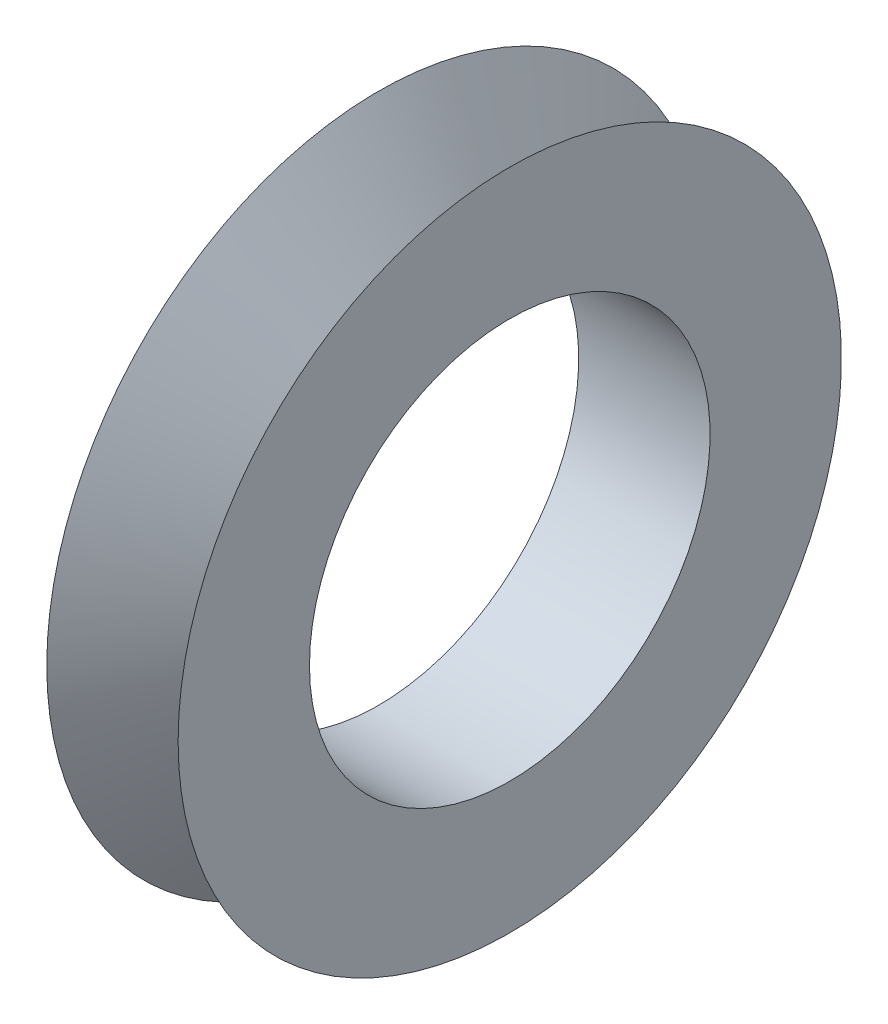
ISO-10303-21;
HEADER;
FILE_DESCRIPTION(('STEP AP214'),'2;1');
FILE_NAME('part.step','',(''),(''),'','','');
FILE_SCHEMA(('AUTOMOTIVE_DESIGN { 1 0 10303 214 1 1 1 1 }'));
ENDSEC;
DATA;
#1=APPLICATION_CONTEXT('core data for automotive mechanical design processes');
#2=APPLICATION_PROTOCOL_DEFINITION('international standard','automotive_design',2000,#1);
#3=PRODUCT_CONTEXT('',#1,'mechanical');
#4=PRODUCT('Part','Part','',(#3));
#5=PRODUCT_RELATED_PRODUCT_CATEGORY('part','',(#4));
#6=PRODUCT_DEFINITION_FORMATION('','',#4);
#7=PRODUCT_DEFINITION_CONTEXT('part definition',#1,'design');
#8=PRODUCT_DEFINITION('design','',#6,#7);
#9=PRODUCT_DEFINITION_SHAPE('','',#8);
#10=(LENGTH_UNIT() NAMED_UNIT(*) SI_UNIT(.MILLI.,.METRE.));
#11=(NAMED_UNIT(*) PLANE_ANGLE_UNIT() SI_UNIT($,.RADIAN.));
#12=(NAMED_UNIT(*) SI_UNIT($,.STERADIAN.) SOLID_ANGLE_UNIT());
#13=UNCERTAINTY_MEASURE_WITH_UNIT(LENGTH_MEASURE(1.E-05),#10,'distance_accuracy_value','');
#14=(GEOMETRIC_REPRESENTATION_CONTEXT(3) GLOBAL_UNCERTAINTY_ASSIGNED_CONTEXT((#13)) GLOBAL_UNIT_ASSIGNED_CONTEXT((#10,
#11,#12)) REPRESENTATION_CONTEXT('',''));
#15=CARTESIAN_POINT('',(0.,0.,0.));
#16=DIRECTION('',(0.,0.,1.));
#17=DIRECTION('',(1.,0.,0.));
#18=AXIS2_PLACEMENT_3D('',#15,#16,#17);
#19=CARTESIAN_POINT('',(2.,0.,0.));
#20=DIRECTION('',(1.,0.,0.));
#21=DIRECTION('',(0.,0.,-1.));
#22=AXIS2_PLACEMENT_3D('',#19,#20,#21);
#23=CONICAL_SURFACE('',#22,10.1,0.982793723247329);
#24=CARTESIAN_POINT('',(0.,0.,0.));
#25=DIRECTION('',(-1.,0.,0.));
#26=DIRECTION('',(0.,0.,1.));
#27=AXIS2_PLACEMENT_3D('',#24,#25,#26);
#28=CIRCLE('',#27,7.1);
#29=CARTESIAN_POINT('',(0.,0.,7.1));
#30=VERTEX_POINT('',#29);
#31=EDGE_CURVE('E10',#30,#30,#28,.T.);
#32=ORIENTED_EDGE('',*,*,#31,.F.);
#33=EDGE_LOOP('',(#32));
#34=FACE_BOUND('',#33,.T.);
#35=CARTESIAN_POINT('',(2.,0.,0.));
#36=DIRECTION('',(-1.,0.,0.));
#37=DIRECTION('',(0.,0.,1.));
#38=AXIS2_PLACEMENT_3D('',#35,#36,#37);
#39=CIRCLE('',#38,10.1);
#40=CARTESIAN_POINT('',(2.,0.,10.1));
#41=VERTEX_POINT('',#40);
#42=EDGE_CURVE('E50',#41,#41,#39,.T.);
#43=ORIENTED_EDGE('',*,*,#42,.T.);
#44=EDGE_LOOP('',(#43));
#45=FACE_BOUND('',#44,.T.);
#46=ADVANCED_FACE('F31',(#34,#45),#23,.T.);
#47=CARTESIAN_POINT('',(0.,0.,0.));
#48=DIRECTION('',(-1.,0.,0.));
#49=DIRECTION('',(0.,0.,1.));
#50=AXIS2_PLACEMENT_3D('',#47,#48,#49);
#51=CONICAL_SURFACE('',#50,7.1,0.982793723247329);
#52=CARTESIAN_POINT('',(-2.,0.,0.));
#53=DIRECTION('',(-1.,0.,0.));
#54=DIRECTION('',(0.,0.,1.));
#55=AXIS2_PLACEMENT_3D('',#52,#53,#54);
#56=CIRCLE('',#55,10.1);
#57=CARTESIAN_POINT('',(-2.,0.,10.1));
#58=VERTEX_POINT('',#57);
#59=EDGE_CURVE('E37',#58,#58,#56,.T.);
#60=ORIENTED_EDGE('',*,*,#59,.F.);
#61=EDGE_LOOP('',(#60));
#62=FACE_BOUND('',#61,.T.);
#63=ORIENTED_EDGE('',*,*,#31,.T.);
#64=EDGE_LOOP('',(#63));
#65=FACE_BOUND('',#64,.T.);
#66=ADVANCED_FACE('F69',(#62,#65),#51,.T.);
#67=CARTESIAN_POINT('',(-2.,6.1,0.));
#68=DIRECTION('',(1.,0.,0.));
#69=DIRECTION('',(0.,0.,-1.));
#70=AXIS2_PLACEMENT_3D('',#67,#68,#69);
#71=PLANE('',#70);
#72=CARTESIAN_POINT('',(-2.,0.,0.));
#73=DIRECTION('',(-1.,0.,0.));
#74=DIRECTION('',(0.,0.,1.));
#75=AXIS2_PLACEMENT_3D('',#72,#73,#74);
#76=CIRCLE('',#75,6.1);
#77=CARTESIAN_POINT('',(-2.,0.,6.1));
#78=VERTEX_POINT('',#77);
#79=EDGE_CURVE('E41',#78,#78,#76,.T.);
#80=ORIENTED_EDGE('',*,*,#79,.F.);
#81=EDGE_LOOP('',(#80));
#82=FACE_BOUND('',#81,.T.);
#83=ORIENTED_EDGE('',*,*,#59,.T.);
#84=EDGE_LOOP('',(#83));
#85=FACE_BOUND('',#84,.T.);
#86=ADVANCED_FACE('F64',(#82,#85),#71,.F.);
#87=CARTESIAN_POINT('',(-6.92407809110628,0.,0.));
#88=DIRECTION('',(-1.,0.,0.));
#89=DIRECTION('',(0.,0.,1.));
#90=AXIS2_PLACEMENT_3D('',#87,#88,#89);
#91=CYLINDRICAL_SURFACE('',#90,6.1);
#92=CARTESIAN_POINT('',(2.,0.,0.));
#93=DIRECTION('',(-1.,0.,0.));
#94=DIRECTION('',(0.,0.,1.));
#95=AXIS2_PLACEMENT_3D('',#92,#93,#94);
#96=CIRCLE('',#95,6.1);
#97=CARTESIAN_POINT('',(2.,0.,6.1));
#98=VERTEX_POINT('',#97);
#99=EDGE_CURVE('E45',#98,#98,#96,.T.);
#100=ORIENTED_EDGE('',*,*,#99,.F.);
#101=EDGE_LOOP('',(#100));
#102=FACE_BOUND('',#101,.T.);
#103=ORIENTED_EDGE('',*,*,#79,.T.);
#104=EDGE_LOOP('',(#103));
#105=FACE_BOUND('',#104,.T.);
#106=ADVANCED_FACE('F58',(#102,#105),#91,.F.);
#107=CARTESIAN_POINT('',(2.,6.1,0.));
#108=DIRECTION('',(-1.,0.,0.));
#109=DIRECTION('',(0.,0.,1.));
#110=AXIS2_PLACEMENT_3D('',#107,#108,#109);
#111=PLANE('',#110);
#112=ORIENTED_EDGE('',*,*,#42,.F.);
#113=EDGE_LOOP('',(#112));
#114=FACE_BOUND('',#113,.T.);
#115=ORIENTED_EDGE('',*,*,#99,.T.);
#116=EDGE_LOOP('',(#115));
#117=FACE_BOUND('',#116,.T.);
#118=ADVANCED_FACE('F55',(#114,#117),#111,.F.);
#119=CLOSED_SHELL('',(#46,#66,#86,#106,#118));
#120=MANIFOLD_SOLID_BREP('B2',#119);
#121=ADVANCED_BREP_SHAPE_REPRESENTATION('',(#18,#120),#14);
#122=SHAPE_DEFINITION_REPRESENTATION(#9,#121);
ENDSEC;
END-ISO-10303-21;
